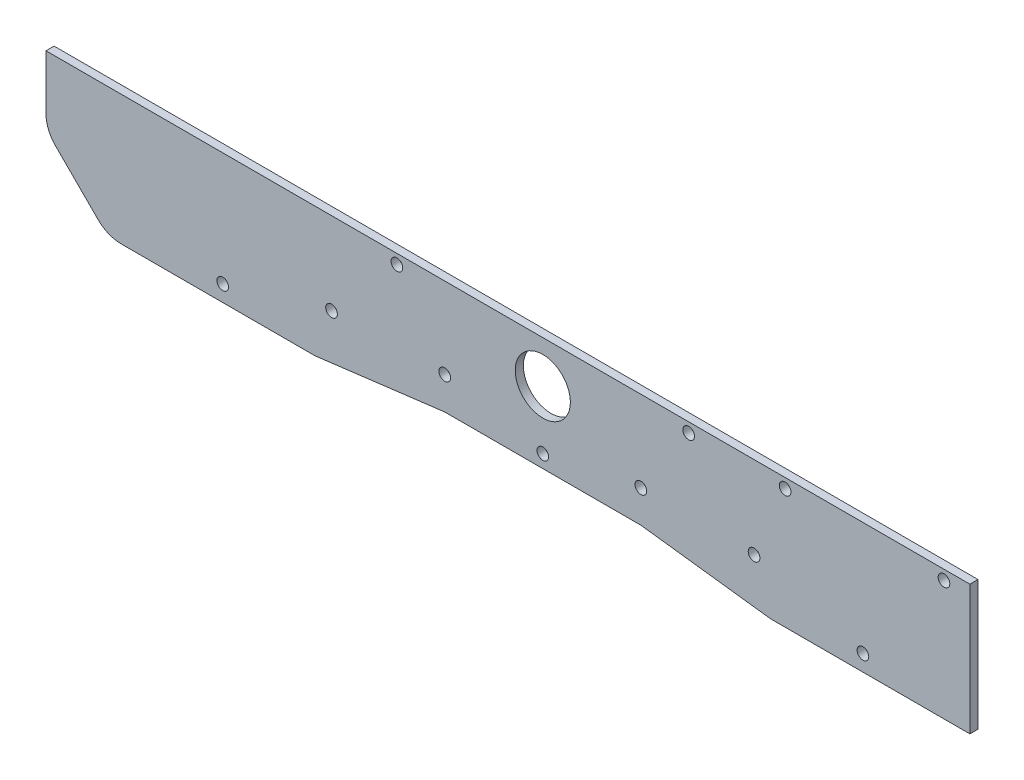
ISO-10303-21;
HEADER;
FILE_DESCRIPTION(('STEP AP214'),'2;1');
FILE_NAME('part.step','',(''),(''),'','','');
FILE_SCHEMA(('AUTOMOTIVE_DESIGN { 1 0 10303 214 1 1 1 1 }'));
ENDSEC;
DATA;
#1=APPLICATION_CONTEXT('core data for automotive mechanical design processes');
#2=APPLICATION_PROTOCOL_DEFINITION('international standard','automotive_design',2000,#1);
#3=PRODUCT_CONTEXT('',#1,'mechanical');
#4=PRODUCT('Part','Part','',(#3));
#5=PRODUCT_RELATED_PRODUCT_CATEGORY('part','',(#4));
#6=PRODUCT_DEFINITION_FORMATION('','',#4);
#7=PRODUCT_DEFINITION_CONTEXT('part definition',#1,'design');
#8=PRODUCT_DEFINITION('design','',#6,#7);
#9=PRODUCT_DEFINITION_SHAPE('','',#8);
#10=(LENGTH_UNIT() NAMED_UNIT(*) SI_UNIT(.MILLI.,.METRE.));
#11=(NAMED_UNIT(*) PLANE_ANGLE_UNIT() SI_UNIT($,.RADIAN.));
#12=(NAMED_UNIT(*) SI_UNIT($,.STERADIAN.) SOLID_ANGLE_UNIT());
#13=UNCERTAINTY_MEASURE_WITH_UNIT(LENGTH_MEASURE(1.E-05),#10,'distance_accuracy_value','');
#14=(GEOMETRIC_REPRESENTATION_CONTEXT(3) GLOBAL_UNCERTAINTY_ASSIGNED_CONTEXT((#13)) GLOBAL_UNIT_ASSIGNED_CONTEXT((#10,
#11,#12)) REPRESENTATION_CONTEXT('',''));
#15=CARTESIAN_POINT('',(0.,0.,0.));
#16=DIRECTION('',(0.,0.,1.));
#17=DIRECTION('',(1.,0.,0.));
#18=AXIS2_PLACEMENT_3D('',#15,#16,#17);
#19=CARTESIAN_POINT('',(0.,0.,3.175));
#20=DIRECTION('',(0.,1.,0.));
#21=DIRECTION('',(-1.,0.,0.));
#22=AXIS2_PLACEMENT_3D('',#19,#20,#21);
#23=PLANE('',#22);
#24=DIRECTION('',(1.,0.,0.));
#25=VECTOR('',#24,1.);
#26=CARTESIAN_POINT('',(0.,0.,0.));
#27=LINE('',#26,#25);
#28=CARTESIAN_POINT('',(-332.559487757862,0.,0.));
#29=VERTEX_POINT('',#28);
#30=CARTESIAN_POINT('',(-256.54,0.,0.));
#31=VERTEX_POINT('',#30);
#32=EDGE_CURVE('E212',#29,#31,#27,.T.);
#33=ORIENTED_EDGE('',*,*,#32,.T.);
#34=DIRECTION('',(0.,0.,1.));
#35=VECTOR('',#34,1.);
#36=CARTESIAN_POINT('',(-256.54,0.,0.));
#37=LINE('',#36,#35);
#38=CARTESIAN_POINT('',(-256.54,0.,3.175));
#39=VERTEX_POINT('',#38);
#40=EDGE_CURVE('E155',#31,#39,#37,.T.);
#41=ORIENTED_EDGE('',*,*,#40,.T.);
#42=DIRECTION('',(1.,0.,0.));
#43=VECTOR('',#42,1.);
#44=CARTESIAN_POINT('',(0.,0.,3.175));
#45=LINE('',#44,#43);
#46=CARTESIAN_POINT('',(-332.559487757862,0.,3.175));
#47=VERTEX_POINT('',#46);
#48=EDGE_CURVE('E218',#47,#39,#45,.T.);
#49=ORIENTED_EDGE('',*,*,#48,.F.);
#50=DIRECTION('',(0.,0.,1.));
#51=VECTOR('',#50,1.);
#52=CARTESIAN_POINT('',(-332.559487757862,0.,3.175));
#53=LINE('',#52,#51);
#54=EDGE_CURVE('E247',#47,#29,#53,.F.);
#55=ORIENTED_EDGE('',*,*,#54,.T.);
#56=EDGE_LOOP('',(#33,#41,#49,#55));
#57=FACE_BOUND('',#56,.T.);
#58=ADVANCED_FACE('F37',(#57),#23,.F.);
#59=CARTESIAN_POINT('',(0.,0.,3.175));
#60=DIRECTION('',(0.,0.,1.));
#61=DIRECTION('',(1.,0.,0.));
#62=AXIS2_PLACEMENT_3D('',#59,#60,#61);
#63=PLANE('',#62);
#64=CARTESIAN_POINT('',(-72.39,46.99,3.175));
#65=DIRECTION('',(0.,0.,1.));
#66=DIRECTION('',(1.,0.,0.));
#67=AXIS2_PLACEMENT_3D('',#64,#65,#66);
#68=CIRCLE('',#67,2.28599999999999);
#69=CARTESIAN_POINT('',(-70.104,46.99,3.175));
#70=VERTEX_POINT('',#69);
#71=EDGE_CURVE('E378',#70,#70,#68,.T.);
#72=ORIENTED_EDGE('',*,*,#71,.F.);
#73=EDGE_LOOP('',(#72));
#74=FACE_BOUND('',#73,.T.);
#75=CARTESIAN_POINT('',(-10.16,46.99,3.175));
#76=DIRECTION('',(0.,0.,1.));
#77=DIRECTION('',(1.,0.,0.));
#78=AXIS2_PLACEMENT_3D('',#75,#76,#77);
#79=CIRCLE('',#78,2.286);
#80=CARTESIAN_POINT('',(-7.874,46.99,3.175));
#81=VERTEX_POINT('',#80);
#82=EDGE_CURVE('E379',#81,#81,#79,.T.);
#83=ORIENTED_EDGE('',*,*,#82,.F.);
#84=EDGE_LOOP('',(#83));
#85=FACE_BOUND('',#84,.T.);
#86=CARTESIAN_POINT('',(-110.1725,46.99,3.175));
#87=DIRECTION('',(0.,0.,-1.));
#88=DIRECTION('',(-1.,0.,0.));
#89=AXIS2_PLACEMENT_3D('',#86,#87,#88);
#90=CIRCLE('',#89,2.28600000000001);
#91=CARTESIAN_POINT('',(-112.4585,46.99,3.175));
#92=VERTEX_POINT('',#91);
#93=EDGE_CURVE('E153',#92,#92,#90,.T.);
#94=ORIENTED_EDGE('',*,*,#93,.T.);
#95=EDGE_LOOP('',(#94));
#96=FACE_BOUND('',#95,.T.);
#97=CARTESIAN_POINT('',(-167.3225,11.43,3.175));
#98=DIRECTION('',(0.,0.,-1.));
#99=DIRECTION('',(-1.,0.,0.));
#100=AXIS2_PLACEMENT_3D('',#97,#98,#99);
#101=CIRCLE('',#100,2.28600000000001);
#102=CARTESIAN_POINT('',(-169.6085,11.43,3.175));
#103=VERTEX_POINT('',#102);
#104=EDGE_CURVE('E396',#103,#103,#101,.T.);
#105=ORIENTED_EDGE('',*,*,#104,.T.);
#106=EDGE_LOOP('',(#105));
#107=FACE_BOUND('',#106,.T.);
#108=CARTESIAN_POINT('',(-224.4725,46.99,3.175));
#109=DIRECTION('',(0.,0.,-1.));
#110=DIRECTION('',(-1.,0.,0.));
#111=AXIS2_PLACEMENT_3D('',#108,#109,#110);
#112=CIRCLE('',#111,2.28600000000001);
#113=CARTESIAN_POINT('',(-226.7585,46.99,3.175));
#114=VERTEX_POINT('',#113);
#115=EDGE_CURVE('E148',#114,#114,#112,.T.);
#116=ORIENTED_EDGE('',*,*,#115,.T.);
#117=EDGE_LOOP('',(#116));
#118=FACE_BOUND('',#117,.T.);
#119=DIRECTION('',(-0.992277876713665,-0.124034734589229,0.));
#120=VECTOR('',#119,1.);
#121=CARTESIAN_POINT('',(-256.54,0.,3.175));
#122=LINE('',#121,#120);
#123=CARTESIAN_POINT('',(-205.74,6.35000000000102,3.175));
#124=VERTEX_POINT('',#123);
#125=EDGE_CURVE('E143',#124,#39,#122,.T.);
#126=ORIENTED_EDGE('',*,*,#125,.F.);
#127=DIRECTION('',(-1.,0.,0.));
#128=VECTOR('',#127,1.);
#129=CARTESIAN_POINT('',(-205.74,6.35000000000102,3.175));
#130=LINE('',#129,#128);
#131=CARTESIAN_POINT('',(-128.905,6.35000000000102,3.175));
#132=VERTEX_POINT('',#131);
#133=EDGE_CURVE('E145',#132,#124,#130,.T.);
#134=ORIENTED_EDGE('',*,*,#133,.F.);
#135=DIRECTION('',(-0.992277876713665,0.124034734589229,0.));
#136=VECTOR('',#135,1.);
#137=CARTESIAN_POINT('',(-128.905,6.35000000000102,3.175));
#138=LINE('',#137,#136);
#139=CARTESIAN_POINT('',(-78.105,0.,3.175));
#140=VERTEX_POINT('',#139);
#141=EDGE_CURVE('E124',#140,#132,#138,.T.);
#142=ORIENTED_EDGE('',*,*,#141,.F.);
#143=CARTESIAN_POINT('',(0.,0.,3.175));
#144=VERTEX_POINT('',#143);
#145=EDGE_CURVE('E217',#140,#144,#45,.T.);
#146=ORIENTED_EDGE('',*,*,#145,.T.);
#147=DIRECTION('',(0.,1.,0.));
#148=VECTOR('',#147,1.);
#149=CARTESIAN_POINT('',(0.,0.,3.175));
#150=LINE('',#149,#148);
#151=CARTESIAN_POINT('',(-1.05408619169834E-12,50.8,3.175));
#152=VERTEX_POINT('',#151);
#153=EDGE_CURVE('E208',#144,#152,#150,.T.);
#154=ORIENTED_EDGE('',*,*,#153,.T.);
#155=DIRECTION('',(-1.,0.,0.));
#156=VECTOR('',#155,1.);
#157=CARTESIAN_POINT('',(-1.05408619169834E-12,50.8,3.175));
#158=LINE('',#157,#156);
#159=CARTESIAN_POINT('',(-361.95,50.8,3.175));
#160=VERTEX_POINT('',#159);
#161=EDGE_CURVE('E211',#152,#160,#158,.T.);
#162=ORIENTED_EDGE('',*,*,#161,.T.);
#163=DIRECTION('',(0.,-1.,0.));
#164=VECTOR('',#163,1.);
#165=CARTESIAN_POINT('',(-361.95,0.,3.175));
#166=LINE('',#165,#164);
#167=CARTESIAN_POINT('',(-361.95,29.3905122421383,3.175));
#168=VERTEX_POINT('',#167);
#169=EDGE_CURVE('E214',#160,#168,#166,.T.);
#170=ORIENTED_EDGE('',*,*,#169,.T.);
#171=CARTESIAN_POINT('',(-349.25,29.3905122421383,3.175));
#172=DIRECTION('',(0.,0.,1.));
#173=DIRECTION('',(1.,0.,0.));
#174=AXIS2_PLACEMENT_3D('',#171,#172,#173);
#175=CIRCLE('',#174,12.7);
#176=CARTESIAN_POINT('',(-358.230256121069,20.4102561210691,3.175));
#177=VERTEX_POINT('',#176);
#178=EDGE_CURVE('E243',#168,#177,#175,.T.);
#179=ORIENTED_EDGE('',*,*,#178,.T.);
#180=DIRECTION('',(-0.707106781186547,0.707106781186548,0.));
#181=VECTOR('',#180,1.);
#182=CARTESIAN_POINT('',(-388.62,50.8,3.175));
#183=LINE('',#182,#181);
#184=CARTESIAN_POINT('',(-341.539743878931,3.71974387893083,3.175));
#185=VERTEX_POINT('',#184);
#186=EDGE_CURVE('E158',#185,#177,#183,.T.);
#187=ORIENTED_EDGE('',*,*,#186,.F.);
#188=CARTESIAN_POINT('',(-332.559487757862,12.7,3.175));
#189=DIRECTION('',(0.,0.,1.));
#190=DIRECTION('',(1.,0.,0.));
#191=AXIS2_PLACEMENT_3D('',#188,#189,#190);
#192=CIRCLE('',#191,12.7);
#193=EDGE_CURVE('E245',#185,#47,#192,.T.);
#194=ORIENTED_EDGE('',*,*,#193,.T.);
#195=ORIENTED_EDGE('',*,*,#48,.T.);
#196=EDGE_LOOP('',(#126,#134,#142,#146,#154,#162,#170,#179,#187,#194,#195));
#197=FACE_BOUND('',#196,.T.);
#198=CARTESIAN_POINT('',(-250.085181934273,18.5066212497721,3.175));
#199=DIRECTION('',(0.,0.,1.));
#200=DIRECTION('',(1.,0.,0.));
#201=AXIS2_PLACEMENT_3D('',#198,#199,#200);
#202=CIRCLE('',#201,2.28600000000004);
#203=CARTESIAN_POINT('',(-247.799181934273,18.5066212497721,3.175));
#204=VERTEX_POINT('',#203);
#205=EDGE_CURVE('E172',#204,#204,#202,.T.);
#206=ORIENTED_EDGE('',*,*,#205,.F.);
#207=EDGE_LOOP('',(#206));
#208=FACE_BOUND('',#207,.T.);
#209=CARTESIAN_POINT('',(-128.905,19.050000000001,3.175));
#210=DIRECTION('',(0.,0.,1.));
#211=DIRECTION('',(1.,0.,0.));
#212=AXIS2_PLACEMENT_3D('',#209,#210,#211);
#213=CIRCLE('',#212,2.28600000000001);
#214=CARTESIAN_POINT('',(-126.619,19.050000000001,3.175));
#215=VERTEX_POINT('',#214);
#216=EDGE_CURVE('E184',#215,#215,#213,.T.);
#217=ORIENTED_EDGE('',*,*,#216,.F.);
#218=EDGE_LOOP('',(#217));
#219=FACE_BOUND('',#218,.T.);
#220=CARTESIAN_POINT('',(-205.74,19.050000000001,3.175));
#221=DIRECTION('',(0.,0.,1.));
#222=DIRECTION('',(1.,0.,0.));
#223=AXIS2_PLACEMENT_3D('',#220,#221,#222);
#224=CIRCLE('',#223,2.28600000000001);
#225=CARTESIAN_POINT('',(-203.454,19.050000000001,3.175));
#226=VERTEX_POINT('',#225);
#227=EDGE_CURVE('E196',#226,#226,#224,.T.);
#228=ORIENTED_EDGE('',*,*,#227,.F.);
#229=EDGE_LOOP('',(#228));
#230=FACE_BOUND('',#229,.T.);
#231=CARTESIAN_POINT('',(-41.91,6.34999999999999,3.175));
#232=DIRECTION('',(0.,0.,1.));
#233=DIRECTION('',(1.,0.,0.));
#234=AXIS2_PLACEMENT_3D('',#231,#232,#233);
#235=CIRCLE('',#234,2.28599999999999);
#236=CARTESIAN_POINT('',(-39.624,6.34999999999999,3.175));
#237=VERTEX_POINT('',#236);
#238=EDGE_CURVE('E202',#237,#237,#235,.T.);
#239=ORIENTED_EDGE('',*,*,#238,.F.);
#240=EDGE_LOOP('',(#239));
#241=FACE_BOUND('',#240,.T.);
#242=CARTESIAN_POINT('',(-292.735,6.34999999999999,3.175));
#243=DIRECTION('',(0.,0.,1.));
#244=DIRECTION('',(1.,0.,0.));
#245=AXIS2_PLACEMENT_3D('',#242,#243,#244);
#246=CIRCLE('',#245,2.28600000000004);
#247=CARTESIAN_POINT('',(-290.449,6.34999999999999,3.175));
#248=VERTEX_POINT('',#247);
#249=EDGE_CURVE('E190',#248,#248,#246,.T.);
#250=ORIENTED_EDGE('',*,*,#249,.F.);
#251=EDGE_LOOP('',(#250));
#252=FACE_BOUND('',#251,.T.);
#253=CARTESIAN_POINT('',(-167.3225,34.29,3.175));
#254=DIRECTION('',(0.,0.,1.));
#255=DIRECTION('',(1.,0.,0.));
#256=AXIS2_PLACEMENT_3D('',#253,#254,#255);
#257=CIRCLE('',#256,10.795);
#258=CARTESIAN_POINT('',(-156.5275,34.29,3.175));
#259=VERTEX_POINT('',#258);
#260=EDGE_CURVE('E178',#259,#259,#257,.T.);
#261=ORIENTED_EDGE('',*,*,#260,.F.);
#262=EDGE_LOOP('',(#261));
#263=FACE_BOUND('',#262,.T.);
#264=CARTESIAN_POINT('',(-84.5598180657267,18.5066212497721,3.175));
#265=DIRECTION('',(0.,0.,1.));
#266=DIRECTION('',(-1.,0.,0.));
#267=AXIS2_PLACEMENT_3D('',#264,#265,#266);
#268=CIRCLE('',#267,2.28600000000004);
#269=CARTESIAN_POINT('',(-86.8458180657267,18.5066212497721,3.175));
#270=VERTEX_POINT('',#269);
#271=EDGE_CURVE('E166',#270,#270,#268,.T.);
#272=ORIENTED_EDGE('',*,*,#271,.F.);
#273=EDGE_LOOP('',(#272));
#274=FACE_BOUND('',#273,.T.);
#275=ADVANCED_FACE('F263',(#74,#85,#96,#107,#118,#197,#208,#219,#230,#241,#252,#263,#274),#63,.T.);
#276=CARTESIAN_POINT('',(0.,0.,0.));
#277=DIRECTION('',(0.,0.,1.));
#278=DIRECTION('',(1.,0.,0.));
#279=AXIS2_PLACEMENT_3D('',#276,#277,#278);
#280=PLANE('',#279);
#281=CARTESIAN_POINT('',(-72.39,46.99,0.));
#282=DIRECTION('',(0.,0.,1.));
#283=DIRECTION('',(1.,0.,0.));
#284=AXIS2_PLACEMENT_3D('',#281,#282,#283);
#285=CIRCLE('',#284,2.28599999999999);
#286=CARTESIAN_POINT('',(-70.104,46.99,0.));
#287=VERTEX_POINT('',#286);
#288=EDGE_CURVE('E375',#287,#287,#285,.T.);
#289=ORIENTED_EDGE('',*,*,#288,.T.);
#290=EDGE_LOOP('',(#289));
#291=FACE_BOUND('',#290,.T.);
#292=CARTESIAN_POINT('',(-10.16,46.99,0.));
#293=DIRECTION('',(0.,0.,1.));
#294=DIRECTION('',(1.,0.,0.));
#295=AXIS2_PLACEMENT_3D('',#292,#293,#294);
#296=CIRCLE('',#295,2.286);
#297=CARTESIAN_POINT('',(-7.874,46.99,0.));
#298=VERTEX_POINT('',#297);
#299=EDGE_CURVE('E383',#298,#298,#296,.T.);
#300=ORIENTED_EDGE('',*,*,#299,.T.);
#301=EDGE_LOOP('',(#300));
#302=FACE_BOUND('',#301,.T.);
#303=CARTESIAN_POINT('',(-110.1725,46.99,0.));
#304=DIRECTION('',(0.,0.,-1.));
#305=DIRECTION('',(-1.,0.,0.));
#306=AXIS2_PLACEMENT_3D('',#303,#304,#305);
#307=CIRCLE('',#306,2.28600000000001);
#308=CARTESIAN_POINT('',(-112.4585,46.99,0.));
#309=VERTEX_POINT('',#308);
#310=EDGE_CURVE('E390',#309,#309,#307,.T.);
#311=ORIENTED_EDGE('',*,*,#310,.F.);
#312=EDGE_LOOP('',(#311));
#313=FACE_BOUND('',#312,.T.);
#314=CARTESIAN_POINT('',(-167.3225,11.43,0.));
#315=DIRECTION('',(0.,0.,-1.));
#316=DIRECTION('',(-1.,0.,0.));
#317=AXIS2_PLACEMENT_3D('',#314,#315,#316);
#318=CIRCLE('',#317,2.28600000000001);
#319=CARTESIAN_POINT('',(-169.6085,11.43,0.));
#320=VERTEX_POINT('',#319);
#321=EDGE_CURVE('E393',#320,#320,#318,.T.);
#322=ORIENTED_EDGE('',*,*,#321,.F.);
#323=EDGE_LOOP('',(#322));
#324=FACE_BOUND('',#323,.T.);
#325=CARTESIAN_POINT('',(-224.4725,46.99,0.));
#326=DIRECTION('',(0.,0.,-1.));
#327=DIRECTION('',(-1.,0.,0.));
#328=AXIS2_PLACEMENT_3D('',#325,#326,#327);
#329=CIRCLE('',#328,2.28600000000001);
#330=CARTESIAN_POINT('',(-226.7585,46.99,0.));
#331=VERTEX_POINT('',#330);
#332=EDGE_CURVE('E398',#331,#331,#329,.T.);
#333=ORIENTED_EDGE('',*,*,#332,.F.);
#334=EDGE_LOOP('',(#333));
#335=FACE_BOUND('',#334,.T.);
#336=DIRECTION('',(-1.,0.,0.));
#337=VECTOR('',#336,1.);
#338=CARTESIAN_POINT('',(-205.74,6.35000000000102,0.));
#339=LINE('',#338,#337);
#340=CARTESIAN_POINT('',(-128.905,6.35000000000102,0.));
#341=VERTEX_POINT('',#340);
#342=CARTESIAN_POINT('',(-205.74,6.35000000000102,0.));
#343=VERTEX_POINT('',#342);
#344=EDGE_CURVE('E132',#341,#343,#339,.T.);
#345=ORIENTED_EDGE('',*,*,#344,.T.);
#346=DIRECTION('',(-0.992277876713665,-0.124034734589229,0.));
#347=VECTOR('',#346,1.);
#348=CARTESIAN_POINT('',(-256.54,0.,0.));
#349=LINE('',#348,#347);
#350=EDGE_CURVE('E136',#343,#31,#349,.T.);
#351=ORIENTED_EDGE('',*,*,#350,.T.);
#352=ORIENTED_EDGE('',*,*,#32,.F.);
#353=CARTESIAN_POINT('',(-332.559487757862,12.7,0.));
#354=DIRECTION('',(0.,0.,1.));
#355=DIRECTION('',(1.,0.,0.));
#356=AXIS2_PLACEMENT_3D('',#353,#354,#355);
#357=CIRCLE('',#356,12.7);
#358=CARTESIAN_POINT('',(-341.539743878931,3.71974387893083,0.));
#359=VERTEX_POINT('',#358);
#360=EDGE_CURVE('E45',#29,#359,#357,.F.);
#361=ORIENTED_EDGE('',*,*,#360,.T.);
#362=DIRECTION('',(-0.707106781186547,0.707106781186548,0.));
#363=VECTOR('',#362,1.);
#364=CARTESIAN_POINT('',(-388.62,50.8,0.));
#365=LINE('',#364,#363);
#366=CARTESIAN_POINT('',(-358.230256121069,20.4102561210691,0.));
#367=VERTEX_POINT('',#366);
#368=EDGE_CURVE('E161',#359,#367,#365,.T.);
#369=ORIENTED_EDGE('',*,*,#368,.T.);
#370=CARTESIAN_POINT('',(-349.25,29.3905122421383,0.));
#371=DIRECTION('',(0.,0.,1.));
#372=DIRECTION('',(1.,0.,0.));
#373=AXIS2_PLACEMENT_3D('',#370,#371,#372);
#374=CIRCLE('',#373,12.7);
#375=CARTESIAN_POINT('',(-361.95,29.3905122421383,0.));
#376=VERTEX_POINT('',#375);
#377=EDGE_CURVE('E60',#367,#376,#374,.F.);
#378=ORIENTED_EDGE('',*,*,#377,.T.);
#379=DIRECTION('',(0.,-1.,0.));
#380=VECTOR('',#379,1.);
#381=CARTESIAN_POINT('',(-361.95,0.,0.));
#382=LINE('',#381,#380);
#383=CARTESIAN_POINT('',(-361.95,50.8,0.));
#384=VERTEX_POINT('',#383);
#385=EDGE_CURVE('E226',#384,#376,#382,.T.);
#386=ORIENTED_EDGE('',*,*,#385,.F.);
#387=DIRECTION('',(-1.,0.,0.));
#388=VECTOR('',#387,1.);
#389=CARTESIAN_POINT('',(-1.05408619169834E-12,50.8,0.));
#390=LINE('',#389,#388);
#391=CARTESIAN_POINT('',(-1.05408619169834E-12,50.8,0.));
#392=VERTEX_POINT('',#391);
#393=EDGE_CURVE('E224',#392,#384,#390,.T.);
#394=ORIENTED_EDGE('',*,*,#393,.F.);
#395=DIRECTION('',(0.,1.,0.));
#396=VECTOR('',#395,1.);
#397=CARTESIAN_POINT('',(0.,0.,0.));
#398=LINE('',#397,#396);
#399=CARTESIAN_POINT('',(0.,0.,0.));
#400=VERTEX_POINT('',#399);
#401=EDGE_CURVE('E205',#400,#392,#398,.T.);
#402=ORIENTED_EDGE('',*,*,#401,.F.);
#403=CARTESIAN_POINT('',(-78.105,0.,0.));
#404=VERTEX_POINT('',#403);
#405=EDGE_CURVE('E142',#404,#400,#27,.T.);
#406=ORIENTED_EDGE('',*,*,#405,.F.);
#407=DIRECTION('',(-0.992277876713665,0.124034734589229,0.));
#408=VECTOR('',#407,1.);
#409=CARTESIAN_POINT('',(-128.905,6.35000000000102,0.));
#410=LINE('',#409,#408);
#411=EDGE_CURVE('E52',#404,#341,#410,.T.);
#412=ORIENTED_EDGE('',*,*,#411,.T.);
#413=EDGE_LOOP('',(#345,#351,#352,#361,#369,#378,#386,#394,#402,#406,#412));
#414=FACE_BOUND('',#413,.T.);
#415=CARTESIAN_POINT('',(-41.91,6.34999999999999,0.));
#416=DIRECTION('',(0.,0.,1.));
#417=DIRECTION('',(1.,0.,0.));
#418=AXIS2_PLACEMENT_3D('',#415,#416,#417);
#419=CIRCLE('',#418,2.28599999999999);
#420=CARTESIAN_POINT('',(-39.624,6.34999999999999,0.));
#421=VERTEX_POINT('',#420);
#422=EDGE_CURVE('E199',#421,#421,#419,.T.);
#423=ORIENTED_EDGE('',*,*,#422,.T.);
#424=EDGE_LOOP('',(#423));
#425=FACE_BOUND('',#424,.T.);
#426=CARTESIAN_POINT('',(-205.74,19.050000000001,0.));
#427=DIRECTION('',(0.,0.,1.));
#428=DIRECTION('',(1.,0.,0.));
#429=AXIS2_PLACEMENT_3D('',#426,#427,#428);
#430=CIRCLE('',#429,2.28600000000001);
#431=CARTESIAN_POINT('',(-203.454,19.050000000001,0.));
#432=VERTEX_POINT('',#431);
#433=EDGE_CURVE('E193',#432,#432,#430,.T.);
#434=ORIENTED_EDGE('',*,*,#433,.T.);
#435=EDGE_LOOP('',(#434));
#436=FACE_BOUND('',#435,.T.);
#437=CARTESIAN_POINT('',(-292.735,6.34999999999999,0.));
#438=DIRECTION('',(0.,0.,1.));
#439=DIRECTION('',(1.,0.,0.));
#440=AXIS2_PLACEMENT_3D('',#437,#438,#439);
#441=CIRCLE('',#440,2.28600000000004);
#442=CARTESIAN_POINT('',(-290.449,6.34999999999999,0.));
#443=VERTEX_POINT('',#442);
#444=EDGE_CURVE('E187',#443,#443,#441,.T.);
#445=ORIENTED_EDGE('',*,*,#444,.T.);
#446=EDGE_LOOP('',(#445));
#447=FACE_BOUND('',#446,.T.);
#448=CARTESIAN_POINT('',(-128.905,19.050000000001,0.));
#449=DIRECTION('',(0.,0.,1.));
#450=DIRECTION('',(1.,0.,0.));
#451=AXIS2_PLACEMENT_3D('',#448,#449,#450);
#452=CIRCLE('',#451,2.28600000000001);
#453=CARTESIAN_POINT('',(-126.619,19.050000000001,0.));
#454=VERTEX_POINT('',#453);
#455=EDGE_CURVE('E181',#454,#454,#452,.T.);
#456=ORIENTED_EDGE('',*,*,#455,.T.);
#457=EDGE_LOOP('',(#456));
#458=FACE_BOUND('',#457,.T.);
#459=CARTESIAN_POINT('',(-167.3225,34.29,0.));
#460=DIRECTION('',(0.,0.,1.));
#461=DIRECTION('',(1.,0.,0.));
#462=AXIS2_PLACEMENT_3D('',#459,#460,#461);
#463=CIRCLE('',#462,10.795);
#464=CARTESIAN_POINT('',(-156.5275,34.29,0.));
#465=VERTEX_POINT('',#464);
#466=EDGE_CURVE('E175',#465,#465,#463,.T.);
#467=ORIENTED_EDGE('',*,*,#466,.T.);
#468=EDGE_LOOP('',(#467));
#469=FACE_BOUND('',#468,.T.);
#470=CARTESIAN_POINT('',(-250.085181934273,18.5066212497721,0.));
#471=DIRECTION('',(0.,0.,1.));
#472=DIRECTION('',(1.,0.,0.));
#473=AXIS2_PLACEMENT_3D('',#470,#471,#472);
#474=CIRCLE('',#473,2.28600000000004);
#475=CARTESIAN_POINT('',(-247.799181934273,18.5066212497721,0.));
#476=VERTEX_POINT('',#475);
#477=EDGE_CURVE('E169',#476,#476,#474,.T.);
#478=ORIENTED_EDGE('',*,*,#477,.T.);
#479=EDGE_LOOP('',(#478));
#480=FACE_BOUND('',#479,.T.);
#481=CARTESIAN_POINT('',(-84.5598180657267,18.5066212497721,0.));
#482=DIRECTION('',(0.,0.,1.));
#483=DIRECTION('',(-1.,0.,0.));
#484=AXIS2_PLACEMENT_3D('',#481,#482,#483);
#485=CIRCLE('',#484,2.28600000000004);
#486=CARTESIAN_POINT('',(-86.8458180657267,18.5066212497721,0.));
#487=VERTEX_POINT('',#486);
#488=EDGE_CURVE('E163',#487,#487,#485,.T.);
#489=ORIENTED_EDGE('',*,*,#488,.T.);
#490=EDGE_LOOP('',(#489));
#491=FACE_BOUND('',#490,.T.);
#492=ADVANCED_FACE('F139',(#291,#302,#313,#324,#335,#414,#425,#436,#447,#458,#469,#480,#491),
#280,.F.);
#493=CARTESIAN_POINT('',(0.,0.,3.175));
#494=DIRECTION('',(-1.,0.,0.));
#495=DIRECTION('',(0.,-1.,0.));
#496=AXIS2_PLACEMENT_3D('',#493,#494,#495);
#497=PLANE('',#496);
#498=ORIENTED_EDGE('',*,*,#401,.T.);
#499=DIRECTION('',(0.,0.,-1.));
#500=VECTOR('',#499,1.);
#501=CARTESIAN_POINT('',(-1.05408619169834E-12,50.8,3.175));
#502=LINE('',#501,#500);
#503=EDGE_CURVE('E235',#152,#392,#502,.T.);
#504=ORIENTED_EDGE('',*,*,#503,.F.);
#505=ORIENTED_EDGE('',*,*,#153,.F.);
#506=DIRECTION('',(0.,0.,-1.));
#507=VECTOR('',#506,1.);
#508=CARTESIAN_POINT('',(0.,0.,3.175));
#509=LINE('',#508,#507);
#510=EDGE_CURVE('E221',#144,#400,#509,.T.);
#511=ORIENTED_EDGE('',*,*,#510,.T.);
#512=EDGE_LOOP('',(#498,#504,#505,#511));
#513=FACE_BOUND('',#512,.T.);
#514=ADVANCED_FACE('F275',(#513),#497,.F.);
#515=CARTESIAN_POINT('',(-1.05408619169834E-12,50.8,3.175));
#516=DIRECTION('',(0.,-1.,0.));
#517=DIRECTION('',(1.,0.,0.));
#518=AXIS2_PLACEMENT_3D('',#515,#516,#517);
#519=PLANE('',#518);
#520=ORIENTED_EDGE('',*,*,#393,.T.);
#521=DIRECTION('',(0.,0.,-1.));
#522=VECTOR('',#521,1.);
#523=CARTESIAN_POINT('',(-361.95,50.8,3.175));
#524=LINE('',#523,#522);
#525=EDGE_CURVE('E232',#160,#384,#524,.T.);
#526=ORIENTED_EDGE('',*,*,#525,.F.);
#527=ORIENTED_EDGE('',*,*,#161,.F.);
#528=ORIENTED_EDGE('',*,*,#503,.T.);
#529=EDGE_LOOP('',(#520,#526,#527,#528));
#530=FACE_BOUND('',#529,.T.);
#531=ADVANCED_FACE('F279',(#530),#519,.F.);
#532=CARTESIAN_POINT('',(-361.95,0.,3.175));
#533=DIRECTION('',(1.,0.,0.));
#534=DIRECTION('',(0.,0.,-1.));
#535=AXIS2_PLACEMENT_3D('',#532,#533,#534);
#536=PLANE('',#535);
#537=ORIENTED_EDGE('',*,*,#385,.T.);
#538=DIRECTION('',(0.,0.,1.));
#539=VECTOR('',#538,1.);
#540=CARTESIAN_POINT('',(-361.95,29.3905122421383,3.175));
#541=LINE('',#540,#539);
#542=EDGE_CURVE('E11',#376,#168,#541,.T.);
#543=ORIENTED_EDGE('',*,*,#542,.T.);
#544=ORIENTED_EDGE('',*,*,#169,.F.);
#545=ORIENTED_EDGE('',*,*,#525,.T.);
#546=EDGE_LOOP('',(#537,#543,#544,#545));
#547=FACE_BOUND('',#546,.T.);
#548=ADVANCED_FACE('F281',(#547),#536,.F.);
#549=ORIENTED_EDGE('',*,*,#145,.F.);
#550=DIRECTION('',(0.,0.,1.));
#551=VECTOR('',#550,1.);
#552=CARTESIAN_POINT('',(-78.105,0.,0.));
#553=LINE('',#552,#551);
#554=EDGE_CURVE('E129',#404,#140,#553,.T.);
#555=ORIENTED_EDGE('',*,*,#554,.F.);
#556=ORIENTED_EDGE('',*,*,#405,.T.);
#557=ORIENTED_EDGE('',*,*,#510,.F.);
#558=EDGE_LOOP('',(#549,#555,#556,#557));
#559=FACE_BOUND('',#558,.T.);
#560=ADVANCED_FACE('F271',(#559),#23,.F.);
#561=CARTESIAN_POINT('',(-41.91,6.34999999999999,3.175));
#562=DIRECTION('',(0.,0.,-1.));
#563=DIRECTION('',(-1.,0.,0.));
#564=AXIS2_PLACEMENT_3D('',#561,#562,#563);
#565=CYLINDRICAL_SURFACE('',#564,2.28599999999999);
#566=ORIENTED_EDGE('',*,*,#238,.T.);
#567=EDGE_LOOP('',(#566));
#568=FACE_BOUND('',#567,.T.);
#569=ORIENTED_EDGE('',*,*,#422,.F.);
#570=EDGE_LOOP('',(#569));
#571=FACE_BOUND('',#570,.T.);
#572=ADVANCED_FACE('F300',(#568,#571),#565,.F.);
#573=CARTESIAN_POINT('',(-205.74,19.050000000001,3.175));
#574=DIRECTION('',(0.,0.,-1.));
#575=DIRECTION('',(-1.,0.,0.));
#576=AXIS2_PLACEMENT_3D('',#573,#574,#575);
#577=CYLINDRICAL_SURFACE('',#576,2.28600000000001);
#578=ORIENTED_EDGE('',*,*,#227,.T.);
#579=EDGE_LOOP('',(#578));
#580=FACE_BOUND('',#579,.T.);
#581=ORIENTED_EDGE('',*,*,#433,.F.);
#582=EDGE_LOOP('',(#581));
#583=FACE_BOUND('',#582,.T.);
#584=ADVANCED_FACE('F305',(#580,#583),#577,.F.);
#585=CARTESIAN_POINT('',(-292.735,6.34999999999999,3.175));
#586=DIRECTION('',(0.,0.,-1.));
#587=DIRECTION('',(-1.,0.,0.));
#588=AXIS2_PLACEMENT_3D('',#585,#586,#587);
#589=CYLINDRICAL_SURFACE('',#588,2.28600000000004);
#590=ORIENTED_EDGE('',*,*,#249,.T.);
#591=EDGE_LOOP('',(#590));
#592=FACE_BOUND('',#591,.T.);
#593=ORIENTED_EDGE('',*,*,#444,.F.);
#594=EDGE_LOOP('',(#593));
#595=FACE_BOUND('',#594,.T.);
#596=ADVANCED_FACE('F325',(#592,#595),#589,.F.);
#597=CARTESIAN_POINT('',(-128.905,19.050000000001,3.175));
#598=DIRECTION('',(0.,0.,-1.));
#599=DIRECTION('',(-1.,0.,0.));
#600=AXIS2_PLACEMENT_3D('',#597,#598,#599);
#601=CYLINDRICAL_SURFACE('',#600,2.28600000000001);
#602=ORIENTED_EDGE('',*,*,#216,.T.);
#603=EDGE_LOOP('',(#602));
#604=FACE_BOUND('',#603,.T.);
#605=ORIENTED_EDGE('',*,*,#455,.F.);
#606=EDGE_LOOP('',(#605));
#607=FACE_BOUND('',#606,.T.);
#608=ADVANCED_FACE('F329',(#604,#607),#601,.F.);
#609=CARTESIAN_POINT('',(-167.3225,34.29,3.175));
#610=DIRECTION('',(0.,0.,-1.));
#611=DIRECTION('',(-1.,0.,0.));
#612=AXIS2_PLACEMENT_3D('',#609,#610,#611);
#613=CYLINDRICAL_SURFACE('',#612,10.795);
#614=ORIENTED_EDGE('',*,*,#260,.T.);
#615=EDGE_LOOP('',(#614));
#616=FACE_BOUND('',#615,.T.);
#617=ORIENTED_EDGE('',*,*,#466,.F.);
#618=EDGE_LOOP('',(#617));
#619=FACE_BOUND('',#618,.T.);
#620=ADVANCED_FACE('F333',(#616,#619),#613,.F.);
#621=CARTESIAN_POINT('',(-250.085181934273,18.5066212497721,3.175));
#622=DIRECTION('',(0.,0.,-1.));
#623=DIRECTION('',(-1.,0.,0.));
#624=AXIS2_PLACEMENT_3D('',#621,#622,#623);
#625=CYLINDRICAL_SURFACE('',#624,2.28600000000004);
#626=ORIENTED_EDGE('',*,*,#205,.T.);
#627=EDGE_LOOP('',(#626));
#628=FACE_BOUND('',#627,.T.);
#629=ORIENTED_EDGE('',*,*,#477,.F.);
#630=EDGE_LOOP('',(#629));
#631=FACE_BOUND('',#630,.T.);
#632=ADVANCED_FACE('F337',(#628,#631),#625,.F.);
#633=CARTESIAN_POINT('',(-84.5598180657267,18.5066212497721,3.175));
#634=DIRECTION('',(0.,0.,-1.));
#635=DIRECTION('',(-1.,0.,0.));
#636=AXIS2_PLACEMENT_3D('',#633,#634,#635);
#637=CYLINDRICAL_SURFACE('',#636,2.28600000000004);
#638=ORIENTED_EDGE('',*,*,#271,.T.);
#639=EDGE_LOOP('',(#638));
#640=FACE_BOUND('',#639,.T.);
#641=ORIENTED_EDGE('',*,*,#488,.F.);
#642=EDGE_LOOP('',(#641));
#643=FACE_BOUND('',#642,.T.);
#644=ADVANCED_FACE('F341',(#640,#643),#637,.F.);
#645=CARTESIAN_POINT('',(-388.62,50.8,0.));
#646=DIRECTION('',(0.707106781186548,0.707106781186547,0.));
#647=DIRECTION('',(-0.707106781186547,0.707106781186548,0.));
#648=AXIS2_PLACEMENT_3D('',#645,#646,#647);
#649=PLANE('',#648);
#650=ORIENTED_EDGE('',*,*,#368,.F.);
#651=DIRECTION('',(0.,0.,1.));
#652=VECTOR('',#651,1.);
#653=CARTESIAN_POINT('',(-341.539743878931,3.71974387893082,0.));
#654=LINE('',#653,#652);
#655=EDGE_CURVE('E240',#359,#185,#654,.T.);
#656=ORIENTED_EDGE('',*,*,#655,.T.);
#657=ORIENTED_EDGE('',*,*,#186,.T.);
#658=DIRECTION('',(0.,0.,1.));
#659=VECTOR('',#658,1.);
#660=CARTESIAN_POINT('',(-358.230256121069,20.4102561210691,0.));
#661=LINE('',#660,#659);
#662=EDGE_CURVE('E238',#177,#367,#661,.F.);
#663=ORIENTED_EDGE('',*,*,#662,.T.);
#664=EDGE_LOOP('',(#650,#656,#657,#663));
#665=FACE_BOUND('',#664,.T.);
#666=ADVANCED_FACE('F256',(#665),#649,.F.);
#667=CARTESIAN_POINT('',(-332.559487757862,12.7,0.));
#668=DIRECTION('',(0.,0.,1.));
#669=DIRECTION('',(1.,0.,0.));
#670=AXIS2_PLACEMENT_3D('',#667,#668,#669);
#671=CYLINDRICAL_SURFACE('',#670,12.7);
#672=ORIENTED_EDGE('',*,*,#360,.F.);
#673=ORIENTED_EDGE('',*,*,#54,.F.);
#674=ORIENTED_EDGE('',*,*,#193,.F.);
#675=ORIENTED_EDGE('',*,*,#655,.F.);
#676=EDGE_LOOP('',(#672,#673,#674,#675));
#677=FACE_BOUND('',#676,.T.);
#678=ADVANCED_FACE('F259',(#677),#671,.T.);
#679=CARTESIAN_POINT('',(-349.25,29.3905122421383,3.175));
#680=DIRECTION('',(0.,0.,1.));
#681=DIRECTION('',(1.,0.,0.));
#682=AXIS2_PLACEMENT_3D('',#679,#680,#681);
#683=CYLINDRICAL_SURFACE('',#682,12.7);
#684=ORIENTED_EDGE('',*,*,#377,.F.);
#685=ORIENTED_EDGE('',*,*,#662,.F.);
#686=ORIENTED_EDGE('',*,*,#178,.F.);
#687=ORIENTED_EDGE('',*,*,#542,.F.);
#688=EDGE_LOOP('',(#684,#685,#686,#687));
#689=FACE_BOUND('',#688,.T.);
#690=ADVANCED_FACE('F39',(#689),#683,.T.);
#691=CARTESIAN_POINT('',(-256.54,0.,0.));
#692=DIRECTION('',(-0.124034734589229,0.992277876713665,0.));
#693=DIRECTION('',(-0.992277876713665,-0.124034734589229,0.));
#694=AXIS2_PLACEMENT_3D('',#691,#692,#693);
#695=PLANE('',#694);
#696=ORIENTED_EDGE('',*,*,#125,.T.);
#697=ORIENTED_EDGE('',*,*,#40,.F.);
#698=ORIENTED_EDGE('',*,*,#350,.F.);
#699=DIRECTION('',(0.,0.,1.));
#700=VECTOR('',#699,1.);
#701=CARTESIAN_POINT('',(-205.74,6.35000000000102,0.));
#702=LINE('',#701,#700);
#703=EDGE_CURVE('E128',#343,#124,#702,.T.);
#704=ORIENTED_EDGE('',*,*,#703,.T.);
#705=EDGE_LOOP('',(#696,#697,#698,#704));
#706=FACE_BOUND('',#705,.T.);
#707=ADVANCED_FACE('F267',(#706),#695,.F.);
#708=CARTESIAN_POINT('',(-205.74,6.35000000000102,0.));
#709=DIRECTION('',(0.,1.,0.));
#710=DIRECTION('',(0.,0.,1.));
#711=AXIS2_PLACEMENT_3D('',#708,#709,#710);
#712=PLANE('',#711);
#713=ORIENTED_EDGE('',*,*,#133,.T.);
#714=ORIENTED_EDGE('',*,*,#703,.F.);
#715=ORIENTED_EDGE('',*,*,#344,.F.);
#716=DIRECTION('',(0.,0.,1.));
#717=VECTOR('',#716,1.);
#718=CARTESIAN_POINT('',(-128.905,6.35000000000102,0.));
#719=LINE('',#718,#717);
#720=EDGE_CURVE('E120',#341,#132,#719,.T.);
#721=ORIENTED_EDGE('',*,*,#720,.T.);
#722=EDGE_LOOP('',(#713,#714,#715,#721));
#723=FACE_BOUND('',#722,.T.);
#724=ADVANCED_FACE('F133',(#723),#712,.F.);
#725=CARTESIAN_POINT('',(-128.905,6.35000000000102,0.));
#726=DIRECTION('',(0.124034734589229,0.992277876713665,0.));
#727=DIRECTION('',(-0.992277876713665,0.124034734589229,0.));
#728=AXIS2_PLACEMENT_3D('',#725,#726,#727);
#729=PLANE('',#728);
#730=ORIENTED_EDGE('',*,*,#141,.T.);
#731=ORIENTED_EDGE('',*,*,#720,.F.);
#732=ORIENTED_EDGE('',*,*,#411,.F.);
#733=ORIENTED_EDGE('',*,*,#554,.T.);
#734=EDGE_LOOP('',(#730,#731,#732,#733));
#735=FACE_BOUND('',#734,.T.);
#736=ADVANCED_FACE('F122',(#735),#729,.F.);
#737=CARTESIAN_POINT('',(-224.4725,46.99,3.175));
#738=DIRECTION('',(0.,0.,-1.));
#739=DIRECTION('',(-1.,0.,0.));
#740=AXIS2_PLACEMENT_3D('',#737,#738,#739);
#741=CYLINDRICAL_SURFACE('',#740,2.28600000000001);
#742=ORIENTED_EDGE('',*,*,#115,.F.);
#743=EDGE_LOOP('',(#742));
#744=FACE_BOUND('',#743,.T.);
#745=ORIENTED_EDGE('',*,*,#332,.T.);
#746=EDGE_LOOP('',(#745));
#747=FACE_BOUND('',#746,.T.);
#748=ADVANCED_FACE('F350',(#744,#747),#741,.F.);
#749=CARTESIAN_POINT('',(-167.3225,11.43,3.175));
#750=DIRECTION('',(0.,0.,-1.));
#751=DIRECTION('',(-1.,0.,0.));
#752=AXIS2_PLACEMENT_3D('',#749,#750,#751);
#753=CYLINDRICAL_SURFACE('',#752,2.28600000000001);
#754=ORIENTED_EDGE('',*,*,#104,.F.);
#755=EDGE_LOOP('',(#754));
#756=FACE_BOUND('',#755,.T.);
#757=ORIENTED_EDGE('',*,*,#321,.T.);
#758=EDGE_LOOP('',(#757));
#759=FACE_BOUND('',#758,.T.);
#760=ADVANCED_FACE('F355',(#756,#759),#753,.F.);
#761=CARTESIAN_POINT('',(-110.1725,46.99,3.175));
#762=DIRECTION('',(0.,0.,-1.));
#763=DIRECTION('',(-1.,0.,0.));
#764=AXIS2_PLACEMENT_3D('',#761,#762,#763);
#765=CYLINDRICAL_SURFACE('',#764,2.28600000000001);
#766=ORIENTED_EDGE('',*,*,#93,.F.);
#767=EDGE_LOOP('',(#766));
#768=FACE_BOUND('',#767,.T.);
#769=ORIENTED_EDGE('',*,*,#310,.T.);
#770=EDGE_LOOP('',(#769));
#771=FACE_BOUND('',#770,.T.);
#772=ADVANCED_FACE('F359',(#768,#771),#765,.F.);
#773=CARTESIAN_POINT('',(-10.16,46.99,0.));
#774=DIRECTION('',(0.,0.,1.));
#775=DIRECTION('',(1.,0.,0.));
#776=AXIS2_PLACEMENT_3D('',#773,#774,#775);
#777=CYLINDRICAL_SURFACE('',#776,2.286);
#778=ORIENTED_EDGE('',*,*,#299,.F.);
#779=EDGE_LOOP('',(#778));
#780=FACE_BOUND('',#779,.T.);
#781=ORIENTED_EDGE('',*,*,#82,.T.);
#782=EDGE_LOOP('',(#781));
#783=FACE_BOUND('',#782,.T.);
#784=ADVANCED_FACE('F363',(#780,#783),#777,.F.);
#785=CARTESIAN_POINT('',(-72.39,46.99,0.));
#786=DIRECTION('',(0.,0.,1.));
#787=DIRECTION('',(1.,0.,0.));
#788=AXIS2_PLACEMENT_3D('',#785,#786,#787);
#789=CYLINDRICAL_SURFACE('',#788,2.28599999999999);
#790=ORIENTED_EDGE('',*,*,#288,.F.);
#791=EDGE_LOOP('',(#790));
#792=FACE_BOUND('',#791,.T.);
#793=ORIENTED_EDGE('',*,*,#71,.T.);
#794=EDGE_LOOP('',(#793));
#795=FACE_BOUND('',#794,.T.);
#796=ADVANCED_FACE('F367',(#792,#795),#789,.F.);
#797=CLOSED_SHELL('',(#58,#275,#492,#514,#531,#548,#560,#572,#584,#596,#608,#620,#632,#644,#666,
#678,#690,#707,#724,#736,#748,#760,#772,#784,#796));
#798=MANIFOLD_SOLID_BREP('B2',#797);
#799=ADVANCED_BREP_SHAPE_REPRESENTATION('',(#18,#798),#14);
#800=SHAPE_DEFINITION_REPRESENTATION(#9,#799);
ENDSEC;
END-ISO-10303-21;
